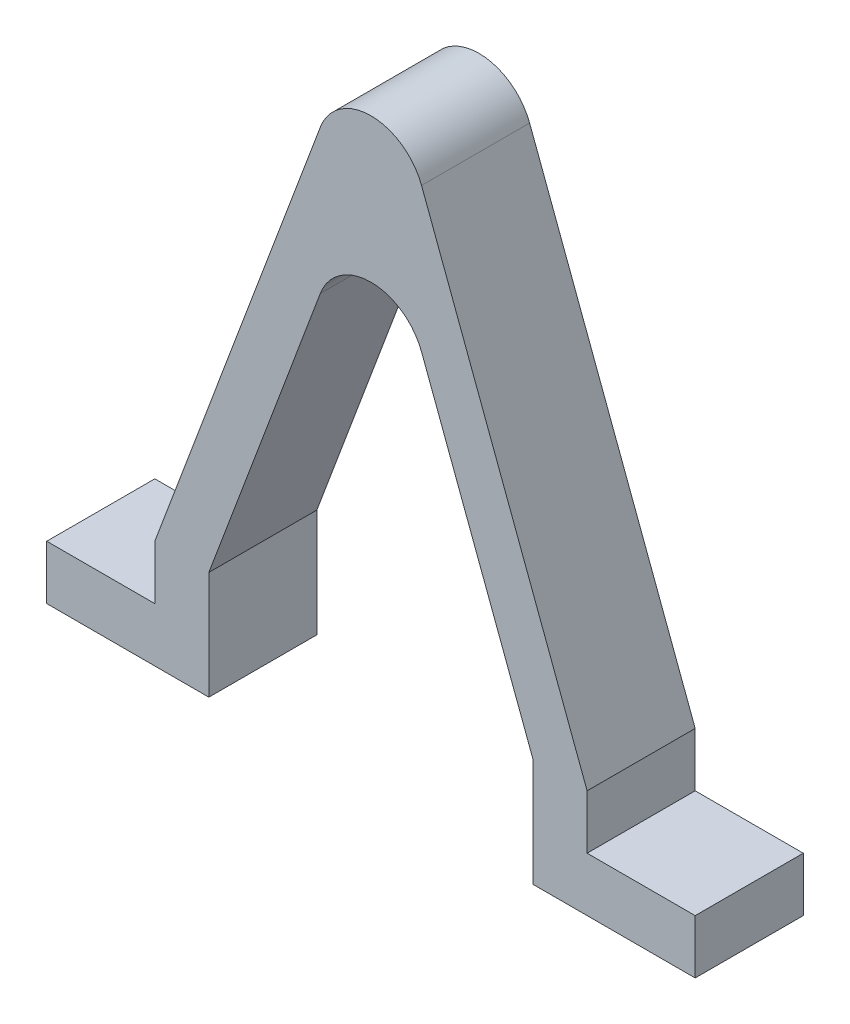
ISO-10303-21;
HEADER;
FILE_DESCRIPTION(('STEP AP214'),'2;1');
FILE_NAME('part.step','',(''),(''),'','','');
FILE_SCHEMA(('AUTOMOTIVE_DESIGN { 1 0 10303 214 1 1 1 1 }'));
ENDSEC;
DATA;
#1=APPLICATION_CONTEXT('core data for automotive mechanical design processes');
#2=APPLICATION_PROTOCOL_DEFINITION('international standard','automotive_design',2000,#1);
#3=PRODUCT_CONTEXT('',#1,'mechanical');
#4=PRODUCT('Part','Part','',(#3));
#5=PRODUCT_RELATED_PRODUCT_CATEGORY('part','',(#4));
#6=PRODUCT_DEFINITION_FORMATION('','',#4);
#7=PRODUCT_DEFINITION_CONTEXT('part definition',#1,'design');
#8=PRODUCT_DEFINITION('design','',#6,#7);
#9=PRODUCT_DEFINITION_SHAPE('','',#8);
#10=(LENGTH_UNIT() NAMED_UNIT(*) SI_UNIT(.MILLI.,.METRE.));
#11=(NAMED_UNIT(*) PLANE_ANGLE_UNIT() SI_UNIT($,.RADIAN.));
#12=(NAMED_UNIT(*) SI_UNIT($,.STERADIAN.) SOLID_ANGLE_UNIT());
#13=UNCERTAINTY_MEASURE_WITH_UNIT(LENGTH_MEASURE(1.E-05),#10,'distance_accuracy_value','');
#14=(GEOMETRIC_REPRESENTATION_CONTEXT(3) GLOBAL_UNCERTAINTY_ASSIGNED_CONTEXT((#13)) GLOBAL_UNIT_ASSIGNED_CONTEXT((#10,
#11,#12)) REPRESENTATION_CONTEXT('',''));
#15=CARTESIAN_POINT('',(0.,0.,0.));
#16=DIRECTION('',(0.,0.,1.));
#17=DIRECTION('',(1.,0.,0.));
#18=AXIS2_PLACEMENT_3D('',#15,#16,#17);
#19=CARTESIAN_POINT('',(0.,5.,10.));
#20=DIRECTION('',(1.,0.,0.));
#21=DIRECTION('',(0.,0.,-1.));
#22=AXIS2_PLACEMENT_3D('',#19,#20,#21);
#23=PLANE('',#22);
#24=DIRECTION('',(0.,-1.,0.));
#25=VECTOR('',#24,1.);
#26=CARTESIAN_POINT('',(0.,5.,0.));
#27=LINE('',#26,#25);
#28=CARTESIAN_POINT('',(0.,5.,0.));
#29=VERTEX_POINT('',#28);
#30=CARTESIAN_POINT('',(0.,0.,0.));
#31=VERTEX_POINT('',#30);
#32=EDGE_CURVE('E178',#29,#31,#27,.T.);
#33=ORIENTED_EDGE('',*,*,#32,.T.);
#34=DIRECTION('',(0.,0.,-1.));
#35=VECTOR('',#34,1.);
#36=CARTESIAN_POINT('',(0.,0.,10.));
#37=LINE('',#36,#35);
#38=CARTESIAN_POINT('',(0.,0.,10.));
#39=VERTEX_POINT('',#38);
#40=EDGE_CURVE('E157',#39,#31,#37,.T.);
#41=ORIENTED_EDGE('',*,*,#40,.F.);
#42=DIRECTION('',(0.,-1.,0.));
#43=VECTOR('',#42,1.);
#44=CARTESIAN_POINT('',(0.,5.,10.));
#45=LINE('',#44,#43);
#46=CARTESIAN_POINT('',(0.,5.,10.));
#47=VERTEX_POINT('',#46);
#48=EDGE_CURVE('E165',#47,#39,#45,.T.);
#49=ORIENTED_EDGE('',*,*,#48,.F.);
#50=DIRECTION('',(0.,0.,-1.));
#51=VECTOR('',#50,1.);
#52=CARTESIAN_POINT('',(0.,5.,10.));
#53=LINE('',#52,#51);
#54=EDGE_CURVE('E231',#47,#29,#53,.T.);
#55=ORIENTED_EDGE('',*,*,#54,.T.);
#56=EDGE_LOOP('',(#33,#41,#49,#55));
#57=FACE_BOUND('',#56,.T.);
#58=ADVANCED_FACE('F39',(#57),#23,.F.);
#59=CARTESIAN_POINT('',(0.,0.,10.));
#60=DIRECTION('',(0.,1.,0.));
#61=DIRECTION('',(0.,0.,1.));
#62=AXIS2_PLACEMENT_3D('',#59,#60,#61);
#63=PLANE('',#62);
#64=DIRECTION('',(1.,0.,0.));
#65=VECTOR('',#64,1.);
#66=CARTESIAN_POINT('',(0.,0.,0.));
#67=LINE('',#66,#65);
#68=CARTESIAN_POINT('',(15.,0.,0.));
#69=VERTEX_POINT('',#68);
#70=EDGE_CURVE('E287',#31,#69,#67,.T.);
#71=ORIENTED_EDGE('',*,*,#70,.T.);
#72=DIRECTION('',(0.,0.,-1.));
#73=VECTOR('',#72,1.);
#74=CARTESIAN_POINT('',(15.,0.,10.));
#75=LINE('',#74,#73);
#76=CARTESIAN_POINT('',(15.,0.,10.));
#77=VERTEX_POINT('',#76);
#78=EDGE_CURVE('E160',#77,#69,#75,.T.);
#79=ORIENTED_EDGE('',*,*,#78,.F.);
#80=DIRECTION('',(1.,0.,0.));
#81=VECTOR('',#80,1.);
#82=CARTESIAN_POINT('',(0.,0.,10.));
#83=LINE('',#82,#81);
#84=EDGE_CURVE('E153',#39,#77,#83,.T.);
#85=ORIENTED_EDGE('',*,*,#84,.F.);
#86=ORIENTED_EDGE('',*,*,#40,.T.);
#87=EDGE_LOOP('',(#71,#79,#85,#86));
#88=FACE_BOUND('',#87,.T.);
#89=ADVANCED_FACE('F155',(#88),#63,.F.);
#90=CARTESIAN_POINT('',(15.,0.,10.));
#91=DIRECTION('',(-1.,0.,0.));
#92=DIRECTION('',(0.,0.,1.));
#93=AXIS2_PLACEMENT_3D('',#90,#91,#92);
#94=PLANE('',#93);
#95=DIRECTION('',(0.,1.,0.));
#96=VECTOR('',#95,1.);
#97=CARTESIAN_POINT('',(15.,0.,0.));
#98=LINE('',#97,#96);
#99=CARTESIAN_POINT('',(15.,10.,0.));
#100=VERTEX_POINT('',#99);
#101=EDGE_CURVE('E278',#69,#100,#98,.T.);
#102=ORIENTED_EDGE('',*,*,#101,.T.);
#103=DIRECTION('',(0.,0.,-1.));
#104=VECTOR('',#103,1.);
#105=CARTESIAN_POINT('',(15.,10.,10.));
#106=LINE('',#105,#104);
#107=CARTESIAN_POINT('',(15.,10.,10.));
#108=VERTEX_POINT('',#107);
#109=EDGE_CURVE('E187',#108,#100,#106,.T.);
#110=ORIENTED_EDGE('',*,*,#109,.F.);
#111=DIRECTION('',(0.,1.,0.));
#112=VECTOR('',#111,1.);
#113=CARTESIAN_POINT('',(15.,0.,10.));
#114=LINE('',#113,#112);
#115=EDGE_CURVE('E164',#77,#108,#114,.T.);
#116=ORIENTED_EDGE('',*,*,#115,.F.);
#117=ORIENTED_EDGE('',*,*,#78,.T.);
#118=EDGE_LOOP('',(#102,#110,#116,#117));
#119=FACE_BOUND('',#118,.T.);
#120=ADVANCED_FACE('F328',(#119),#94,.F.);
#121=CARTESIAN_POINT('',(15.,10.,10.));
#122=DIRECTION('',(-0.936329177569045,0.351123441588392,0.));
#123=DIRECTION('',(-0.351123441588392,-0.936329177569045,0.));
#124=AXIS2_PLACEMENT_3D('',#121,#122,#123);
#125=PLANE('',#124);
#126=DIRECTION('',(0.351123441588392,0.936329177569045,0.));
#127=VECTOR('',#126,1.);
#128=CARTESIAN_POINT('',(15.,10.,0.));
#129=LINE('',#128,#127);
#130=CARTESIAN_POINT('',(25.3183541121548,37.5156109657461,0.));
#131=VERTEX_POINT('',#130);
#132=EDGE_CURVE('E272',#100,#131,#129,.T.);
#133=ORIENTED_EDGE('',*,*,#132,.T.);
#134=DIRECTION('',(0.,0.,-1.));
#135=VECTOR('',#134,1.);
#136=CARTESIAN_POINT('',(25.3183541121548,37.5156109657461,10.));
#137=LINE('',#136,#135);
#138=CARTESIAN_POINT('',(25.3183541121548,37.5156109657461,10.));
#139=VERTEX_POINT('',#138);
#140=EDGE_CURVE('E185',#131,#139,#137,.F.);
#141=ORIENTED_EDGE('',*,*,#140,.T.);
#142=DIRECTION('',(0.351123441588392,0.936329177569045,0.));
#143=VECTOR('',#142,1.);
#144=CARTESIAN_POINT('',(15.,10.,10.));
#145=LINE('',#144,#143);
#146=EDGE_CURVE('E275',#108,#139,#145,.T.);
#147=ORIENTED_EDGE('',*,*,#146,.F.);
#148=ORIENTED_EDGE('',*,*,#109,.T.);
#149=EDGE_LOOP('',(#133,#141,#147,#148));
#150=FACE_BOUND('',#149,.T.);
#151=ADVANCED_FACE('F271',(#150),#125,.F.);
#152=CARTESIAN_POINT('',(30.,50.,10.));
#153=DIRECTION('',(0.936329177569045,0.351123441588392,0.));
#154=DIRECTION('',(-0.351123441588392,0.936329177569045,0.));
#155=AXIS2_PLACEMENT_3D('',#152,#153,#154);
#156=PLANE('',#155);
#157=DIRECTION('',(0.351123441588392,-0.936329177569045,0.));
#158=VECTOR('',#157,1.);
#159=CARTESIAN_POINT('',(30.,50.,10.));
#160=LINE('',#159,#158);
#161=CARTESIAN_POINT('',(34.6816458878452,37.5156109657461,10.));
#162=VERTEX_POINT('',#161);
#163=CARTESIAN_POINT('',(45.,10.,10.));
#164=VERTEX_POINT('',#163);
#165=EDGE_CURVE('E332',#162,#164,#160,.T.);
#166=ORIENTED_EDGE('',*,*,#165,.F.);
#167=DIRECTION('',(0.,0.,-1.));
#168=VECTOR('',#167,1.);
#169=CARTESIAN_POINT('',(34.6816458878452,37.5156109657461,0.));
#170=LINE('',#169,#168);
#171=CARTESIAN_POINT('',(34.6816458878452,37.5156109657461,0.));
#172=VERTEX_POINT('',#171);
#173=EDGE_CURVE('E180',#162,#172,#170,.T.);
#174=ORIENTED_EDGE('',*,*,#173,.T.);
#175=DIRECTION('',(0.351123441588392,-0.936329177569045,0.));
#176=VECTOR('',#175,1.);
#177=CARTESIAN_POINT('',(30.,50.,0.));
#178=LINE('',#177,#176);
#179=CARTESIAN_POINT('',(45.,10.,0.));
#180=VERTEX_POINT('',#179);
#181=EDGE_CURVE('E281',#172,#180,#178,.T.);
#182=ORIENTED_EDGE('',*,*,#181,.T.);
#183=DIRECTION('',(0.,0.,-1.));
#184=VECTOR('',#183,1.);
#185=CARTESIAN_POINT('',(45.,10.,10.));
#186=LINE('',#185,#184);
#187=EDGE_CURVE('E261',#164,#180,#186,.T.);
#188=ORIENTED_EDGE('',*,*,#187,.F.);
#189=EDGE_LOOP('',(#166,#174,#182,#188));
#190=FACE_BOUND('',#189,.T.);
#191=ADVANCED_FACE('F367',(#190),#156,.F.);
#192=CARTESIAN_POINT('',(45.,10.,10.));
#193=DIRECTION('',(1.,0.,0.));
#194=DIRECTION('',(0.,0.,-1.));
#195=AXIS2_PLACEMENT_3D('',#192,#193,#194);
#196=PLANE('',#195);
#197=DIRECTION('',(0.,-1.,0.));
#198=VECTOR('',#197,1.);
#199=CARTESIAN_POINT('',(45.,10.,0.));
#200=LINE('',#199,#198);
#201=CARTESIAN_POINT('',(45.,0.,0.));
#202=VERTEX_POINT('',#201);
#203=EDGE_CURVE('E285',#180,#202,#200,.T.);
#204=ORIENTED_EDGE('',*,*,#203,.T.);
#205=DIRECTION('',(0.,0.,-1.));
#206=VECTOR('',#205,1.);
#207=CARTESIAN_POINT('',(45.,0.,10.));
#208=LINE('',#207,#206);
#209=CARTESIAN_POINT('',(45.,0.,10.));
#210=VERTEX_POINT('',#209);
#211=EDGE_CURVE('E257',#210,#202,#208,.T.);
#212=ORIENTED_EDGE('',*,*,#211,.F.);
#213=DIRECTION('',(0.,-1.,0.));
#214=VECTOR('',#213,1.);
#215=CARTESIAN_POINT('',(45.,10.,10.));
#216=LINE('',#215,#214);
#217=EDGE_CURVE('E337',#164,#210,#216,.T.);
#218=ORIENTED_EDGE('',*,*,#217,.F.);
#219=ORIENTED_EDGE('',*,*,#187,.T.);
#220=EDGE_LOOP('',(#204,#212,#218,#219));
#221=FACE_BOUND('',#220,.T.);
#222=ADVANCED_FACE('F363',(#221),#196,.F.);
#223=CARTESIAN_POINT('',(45.,0.,10.));
#224=DIRECTION('',(0.,1.,0.));
#225=DIRECTION('',(0.,0.,1.));
#226=AXIS2_PLACEMENT_3D('',#223,#224,#225);
#227=PLANE('',#226);
#228=DIRECTION('',(1.,0.,0.));
#229=VECTOR('',#228,1.);
#230=CARTESIAN_POINT('',(45.,0.,0.));
#231=LINE('',#230,#229);
#232=CARTESIAN_POINT('',(60.,0.,0.));
#233=VERTEX_POINT('',#232);
#234=EDGE_CURVE('E293',#202,#233,#231,.T.);
#235=ORIENTED_EDGE('',*,*,#234,.T.);
#236=DIRECTION('',(0.,0.,-1.));
#237=VECTOR('',#236,1.);
#238=CARTESIAN_POINT('',(60.,0.,10.));
#239=LINE('',#238,#237);
#240=CARTESIAN_POINT('',(60.,0.,10.));
#241=VERTEX_POINT('',#240);
#242=EDGE_CURVE('E253',#241,#233,#239,.T.);
#243=ORIENTED_EDGE('',*,*,#242,.F.);
#244=DIRECTION('',(1.,0.,0.));
#245=VECTOR('',#244,1.);
#246=CARTESIAN_POINT('',(45.,0.,10.));
#247=LINE('',#246,#245);
#248=EDGE_CURVE('E340',#210,#241,#247,.T.);
#249=ORIENTED_EDGE('',*,*,#248,.F.);
#250=ORIENTED_EDGE('',*,*,#211,.T.);
#251=EDGE_LOOP('',(#235,#243,#249,#250));
#252=FACE_BOUND('',#251,.T.);
#253=ADVANCED_FACE('F359',(#252),#227,.F.);
#254=CARTESIAN_POINT('',(60.,0.,10.));
#255=DIRECTION('',(-1.,0.,0.));
#256=DIRECTION('',(0.,0.,1.));
#257=AXIS2_PLACEMENT_3D('',#254,#255,#256);
#258=PLANE('',#257);
#259=DIRECTION('',(0.,1.,0.));
#260=VECTOR('',#259,1.);
#261=CARTESIAN_POINT('',(60.,0.,0.));
#262=LINE('',#261,#260);
#263=CARTESIAN_POINT('',(60.,5.00000000000001,0.));
#264=VERTEX_POINT('',#263);
#265=EDGE_CURVE('E296',#233,#264,#262,.T.);
#266=ORIENTED_EDGE('',*,*,#265,.T.);
#267=DIRECTION('',(0.,0.,-1.));
#268=VECTOR('',#267,1.);
#269=CARTESIAN_POINT('',(60.,5.00000000000001,10.));
#270=LINE('',#269,#268);
#271=CARTESIAN_POINT('',(60.,5.00000000000001,10.));
#272=VERTEX_POINT('',#271);
#273=EDGE_CURVE('E249',#272,#264,#270,.T.);
#274=ORIENTED_EDGE('',*,*,#273,.F.);
#275=DIRECTION('',(0.,1.,0.));
#276=VECTOR('',#275,1.);
#277=CARTESIAN_POINT('',(60.,0.,10.));
#278=LINE('',#277,#276);
#279=EDGE_CURVE('E343',#241,#272,#278,.T.);
#280=ORIENTED_EDGE('',*,*,#279,.F.);
#281=ORIENTED_EDGE('',*,*,#242,.T.);
#282=EDGE_LOOP('',(#266,#274,#280,#281));
#283=FACE_BOUND('',#282,.T.);
#284=ADVANCED_FACE('F355',(#283),#258,.F.);
#285=CARTESIAN_POINT('',(60.,5.00000000000001,10.));
#286=DIRECTION('',(0.,-1.,0.));
#287=DIRECTION('',(0.,0.,-1.));
#288=AXIS2_PLACEMENT_3D('',#285,#286,#287);
#289=PLANE('',#288);
#290=DIRECTION('',(-1.,0.,0.));
#291=VECTOR('',#290,1.);
#292=CARTESIAN_POINT('',(60.,5.00000000000001,0.));
#293=LINE('',#292,#291);
#294=CARTESIAN_POINT('',(50.,5.00000000000001,0.));
#295=VERTEX_POINT('',#294);
#296=EDGE_CURVE('E299',#264,#295,#293,.T.);
#297=ORIENTED_EDGE('',*,*,#296,.T.);
#298=DIRECTION('',(0.,0.,-1.));
#299=VECTOR('',#298,1.);
#300=CARTESIAN_POINT('',(50.,5.00000000000001,10.));
#301=LINE('',#300,#299);
#302=CARTESIAN_POINT('',(50.,5.00000000000001,10.));
#303=VERTEX_POINT('',#302);
#304=EDGE_CURVE('E245',#303,#295,#301,.T.);
#305=ORIENTED_EDGE('',*,*,#304,.F.);
#306=DIRECTION('',(-1.,0.,0.));
#307=VECTOR('',#306,1.);
#308=CARTESIAN_POINT('',(60.,5.00000000000001,10.));
#309=LINE('',#308,#307);
#310=EDGE_CURVE('E318',#272,#303,#309,.T.);
#311=ORIENTED_EDGE('',*,*,#310,.F.);
#312=ORIENTED_EDGE('',*,*,#273,.T.);
#313=EDGE_LOOP('',(#297,#305,#311,#312));
#314=FACE_BOUND('',#313,.T.);
#315=ADVANCED_FACE('F350',(#314),#289,.F.);
#316=CARTESIAN_POINT('',(50.,5.00000000000001,10.));
#317=DIRECTION('',(-1.,0.,0.));
#318=DIRECTION('',(0.,0.,1.));
#319=AXIS2_PLACEMENT_3D('',#316,#317,#318);
#320=PLANE('',#319);
#321=DIRECTION('',(0.,1.,0.));
#322=VECTOR('',#321,1.);
#323=CARTESIAN_POINT('',(50.,5.00000000000001,0.));
#324=LINE('',#323,#322);
#325=CARTESIAN_POINT('',(50.,10.,0.));
#326=VERTEX_POINT('',#325);
#327=EDGE_CURVE('E225',#295,#326,#324,.T.);
#328=ORIENTED_EDGE('',*,*,#327,.T.);
#329=DIRECTION('',(0.,0.,-1.));
#330=VECTOR('',#329,1.);
#331=CARTESIAN_POINT('',(50.,10.,10.));
#332=LINE('',#331,#330);
#333=CARTESIAN_POINT('',(50.,10.,10.));
#334=VERTEX_POINT('',#333);
#335=EDGE_CURVE('E241',#334,#326,#332,.T.);
#336=ORIENTED_EDGE('',*,*,#335,.F.);
#337=DIRECTION('',(0.,1.,0.));
#338=VECTOR('',#337,1.);
#339=CARTESIAN_POINT('',(50.,5.00000000000001,10.));
#340=LINE('',#339,#338);
#341=EDGE_CURVE('E312',#303,#334,#340,.T.);
#342=ORIENTED_EDGE('',*,*,#341,.F.);
#343=ORIENTED_EDGE('',*,*,#304,.T.);
#344=EDGE_LOOP('',(#328,#336,#342,#343));
#345=FACE_BOUND('',#344,.T.);
#346=ADVANCED_FACE('F305',(#345),#320,.F.);
#347=CARTESIAN_POINT('',(50.,10.,10.));
#348=DIRECTION('',(-0.936329177569045,-0.351123441588392,0.));
#349=DIRECTION('',(0.351123441588392,-0.936329177569045,0.));
#350=AXIS2_PLACEMENT_3D('',#347,#348,#349);
#351=PLANE('',#350);
#352=DIRECTION('',(-0.351123441588392,0.936329177569044,0.));
#353=VECTOR('',#352,1.);
#354=CARTESIAN_POINT('',(50.,10.,0.));
#355=LINE('',#354,#353);
#356=CARTESIAN_POINT('',(34.6816458878452,50.8489442990794,0.));
#357=VERTEX_POINT('',#356);
#358=EDGE_CURVE('E220',#326,#357,#355,.T.);
#359=ORIENTED_EDGE('',*,*,#358,.T.);
#360=DIRECTION('',(0.,0.,-1.));
#361=VECTOR('',#360,1.);
#362=CARTESIAN_POINT('',(34.6816458878452,50.8489442990794,10.));
#363=LINE('',#362,#361);
#364=CARTESIAN_POINT('',(34.6816458878452,50.8489442990794,10.));
#365=VERTEX_POINT('',#364);
#366=EDGE_CURVE('E48',#357,#365,#363,.F.);
#367=ORIENTED_EDGE('',*,*,#366,.T.);
#368=DIRECTION('',(-0.351123441588392,0.936329177569044,0.));
#369=VECTOR('',#368,1.);
#370=CARTESIAN_POINT('',(50.,10.,10.));
#371=LINE('',#370,#369);
#372=EDGE_CURVE('E310',#334,#365,#371,.T.);
#373=ORIENTED_EDGE('',*,*,#372,.F.);
#374=ORIENTED_EDGE('',*,*,#335,.T.);
#375=EDGE_LOOP('',(#359,#367,#373,#374));
#376=FACE_BOUND('',#375,.T.);
#377=ADVANCED_FACE('F309',(#376),#351,.F.);
#378=CARTESIAN_POINT('',(30.,63.3333333333333,10.));
#379=DIRECTION('',(0.936329177569045,-0.351123441588392,0.));
#380=DIRECTION('',(0.351123441588392,0.936329177569045,0.));
#381=AXIS2_PLACEMENT_3D('',#378,#379,#380);
#382=PLANE('',#381);
#383=DIRECTION('',(-0.351123441588392,-0.936329177569044,0.));
#384=VECTOR('',#383,1.);
#385=CARTESIAN_POINT('',(30.,63.3333333333333,10.));
#386=LINE('',#385,#384);
#387=CARTESIAN_POINT('',(25.3183541121548,50.8489442990794,10.));
#388=VERTEX_POINT('',#387);
#389=CARTESIAN_POINT('',(10.,10.,10.));
#390=VERTEX_POINT('',#389);
#391=EDGE_CURVE('E212',#388,#390,#386,.T.);
#392=ORIENTED_EDGE('',*,*,#391,.F.);
#393=DIRECTION('',(0.,0.,-1.));
#394=VECTOR('',#393,1.);
#395=CARTESIAN_POINT('',(25.3183541121548,50.8489442990794,10.));
#396=LINE('',#395,#394);
#397=CARTESIAN_POINT('',(25.3183541121548,50.8489442990794,0.));
#398=VERTEX_POINT('',#397);
#399=EDGE_CURVE('E199',#388,#398,#396,.T.);
#400=ORIENTED_EDGE('',*,*,#399,.T.);
#401=DIRECTION('',(-0.351123441588392,-0.936329177569044,0.));
#402=VECTOR('',#401,1.);
#403=CARTESIAN_POINT('',(30.,63.3333333333333,0.));
#404=LINE('',#403,#402);
#405=CARTESIAN_POINT('',(10.,10.,0.));
#406=VERTEX_POINT('',#405);
#407=EDGE_CURVE('E210',#398,#406,#404,.T.);
#408=ORIENTED_EDGE('',*,*,#407,.T.);
#409=DIRECTION('',(0.,0.,-1.));
#410=VECTOR('',#409,1.);
#411=CARTESIAN_POINT('',(10.,10.,10.));
#412=LINE('',#411,#410);
#413=EDGE_CURVE('E238',#390,#406,#412,.T.);
#414=ORIENTED_EDGE('',*,*,#413,.F.);
#415=EDGE_LOOP('',(#392,#400,#408,#414));
#416=FACE_BOUND('',#415,.T.);
#417=ADVANCED_FACE('F208',(#416),#382,.F.);
#418=CARTESIAN_POINT('',(10.,10.,10.));
#419=DIRECTION('',(1.,0.,0.));
#420=DIRECTION('',(0.,0.,-1.));
#421=AXIS2_PLACEMENT_3D('',#418,#419,#420);
#422=PLANE('',#421);
#423=DIRECTION('',(0.,-1.,0.));
#424=VECTOR('',#423,1.);
#425=CARTESIAN_POINT('',(10.,10.,0.));
#426=LINE('',#425,#424);
#427=CARTESIAN_POINT('',(10.,5.,0.));
#428=VERTEX_POINT('',#427);
#429=EDGE_CURVE('E218',#406,#428,#426,.T.);
#430=ORIENTED_EDGE('',*,*,#429,.T.);
#431=DIRECTION('',(0.,0.,-1.));
#432=VECTOR('',#431,1.);
#433=CARTESIAN_POINT('',(10.,5.,10.));
#434=LINE('',#433,#432);
#435=CARTESIAN_POINT('',(10.,5.,10.));
#436=VERTEX_POINT('',#435);
#437=EDGE_CURVE('E234',#436,#428,#434,.T.);
#438=ORIENTED_EDGE('',*,*,#437,.F.);
#439=DIRECTION('',(0.,-1.,0.));
#440=VECTOR('',#439,1.);
#441=CARTESIAN_POINT('',(10.,10.,10.));
#442=LINE('',#441,#440);
#443=EDGE_CURVE('E316',#390,#436,#442,.T.);
#444=ORIENTED_EDGE('',*,*,#443,.F.);
#445=ORIENTED_EDGE('',*,*,#413,.T.);
#446=EDGE_LOOP('',(#430,#438,#444,#445));
#447=FACE_BOUND('',#446,.T.);
#448=ADVANCED_FACE('F405',(#447),#422,.F.);
#449=CARTESIAN_POINT('',(10.,5.,10.));
#450=DIRECTION('',(0.,-1.,0.));
#451=DIRECTION('',(1.,0.,0.));
#452=AXIS2_PLACEMENT_3D('',#449,#450,#451);
#453=PLANE('',#452);
#454=DIRECTION('',(-1.,0.,0.));
#455=VECTOR('',#454,1.);
#456=CARTESIAN_POINT('',(10.,5.,0.));
#457=LINE('',#456,#455);
#458=EDGE_CURVE('E175',#428,#29,#457,.T.);
#459=ORIENTED_EDGE('',*,*,#458,.T.);
#460=ORIENTED_EDGE('',*,*,#54,.F.);
#461=DIRECTION('',(-1.,0.,0.));
#462=VECTOR('',#461,1.);
#463=CARTESIAN_POINT('',(10.,5.,10.));
#464=LINE('',#463,#462);
#465=EDGE_CURVE('E170',#436,#47,#464,.T.);
#466=ORIENTED_EDGE('',*,*,#465,.F.);
#467=ORIENTED_EDGE('',*,*,#437,.T.);
#468=EDGE_LOOP('',(#459,#460,#466,#467));
#469=FACE_BOUND('',#468,.T.);
#470=ADVANCED_FACE('F408',(#469),#453,.F.);
#471=CARTESIAN_POINT('',(0.,0.,10.));
#472=DIRECTION('',(0.,0.,1.));
#473=DIRECTION('',(1.,0.,0.));
#474=AXIS2_PLACEMENT_3D('',#471,#472,#473);
#475=PLANE('',#474);
#476=ORIENTED_EDGE('',*,*,#372,.T.);
#477=CARTESIAN_POINT('',(30.,49.0933270911375,10.));
#478=DIRECTION('',(0.,0.,1.));
#479=DIRECTION('',(1.,0.,0.));
#480=AXIS2_PLACEMENT_3D('',#477,#478,#479);
#481=CIRCLE('',#480,5.);
#482=EDGE_CURVE('E11',#365,#388,#481,.T.);
#483=ORIENTED_EDGE('',*,*,#482,.T.);
#484=ORIENTED_EDGE('',*,*,#391,.T.);
#485=ORIENTED_EDGE('',*,*,#443,.T.);
#486=ORIENTED_EDGE('',*,*,#465,.T.);
#487=ORIENTED_EDGE('',*,*,#48,.T.);
#488=ORIENTED_EDGE('',*,*,#84,.T.);
#489=ORIENTED_EDGE('',*,*,#115,.T.);
#490=ORIENTED_EDGE('',*,*,#146,.T.);
#491=CARTESIAN_POINT('',(30.,35.7599937578041,10.));
#492=DIRECTION('',(0.,0.,1.));
#493=DIRECTION('',(1.,0.,0.));
#494=AXIS2_PLACEMENT_3D('',#491,#492,#493);
#495=CIRCLE('',#494,5.);
#496=EDGE_CURVE('E196',#139,#162,#495,.F.);
#497=ORIENTED_EDGE('',*,*,#496,.T.);
#498=ORIENTED_EDGE('',*,*,#165,.T.);
#499=ORIENTED_EDGE('',*,*,#217,.T.);
#500=ORIENTED_EDGE('',*,*,#248,.T.);
#501=ORIENTED_EDGE('',*,*,#279,.T.);
#502=ORIENTED_EDGE('',*,*,#310,.T.);
#503=ORIENTED_EDGE('',*,*,#341,.T.);
#504=EDGE_LOOP('',(#476,#483,#484,#485,#486,#487,#488,#489,#490,#497,#498,#499,#500,#501,#502,#503));
#505=FACE_BOUND('',#504,.T.);
#506=ADVANCED_FACE('F168',(#505),#475,.T.);
#507=CARTESIAN_POINT('',(0.,0.,0.));
#508=DIRECTION('',(0.,0.,1.));
#509=DIRECTION('',(1.,0.,0.));
#510=AXIS2_PLACEMENT_3D('',#507,#508,#509);
#511=PLANE('',#510);
#512=ORIENTED_EDGE('',*,*,#407,.F.);
#513=CARTESIAN_POINT('',(30.,49.0933270911375,0.));
#514=DIRECTION('',(0.,0.,1.));
#515=DIRECTION('',(1.,0.,0.));
#516=AXIS2_PLACEMENT_3D('',#513,#514,#515);
#517=CIRCLE('',#516,5.);
#518=EDGE_CURVE('E62',#398,#357,#517,.F.);
#519=ORIENTED_EDGE('',*,*,#518,.T.);
#520=ORIENTED_EDGE('',*,*,#358,.F.);
#521=ORIENTED_EDGE('',*,*,#327,.F.);
#522=ORIENTED_EDGE('',*,*,#296,.F.);
#523=ORIENTED_EDGE('',*,*,#265,.F.);
#524=ORIENTED_EDGE('',*,*,#234,.F.);
#525=ORIENTED_EDGE('',*,*,#203,.F.);
#526=ORIENTED_EDGE('',*,*,#181,.F.);
#527=CARTESIAN_POINT('',(30.,35.7599937578041,0.));
#528=DIRECTION('',(0.,0.,1.));
#529=DIRECTION('',(1.,0.,0.));
#530=AXIS2_PLACEMENT_3D('',#527,#528,#529);
#531=CIRCLE('',#530,5.);
#532=EDGE_CURVE('E193',#172,#131,#531,.T.);
#533=ORIENTED_EDGE('',*,*,#532,.T.);
#534=ORIENTED_EDGE('',*,*,#132,.F.);
#535=ORIENTED_EDGE('',*,*,#101,.F.);
#536=ORIENTED_EDGE('',*,*,#70,.F.);
#537=ORIENTED_EDGE('',*,*,#32,.F.);
#538=ORIENTED_EDGE('',*,*,#458,.F.);
#539=ORIENTED_EDGE('',*,*,#429,.F.);
#540=EDGE_LOOP('',(#512,#519,#520,#521,#522,#523,#524,#525,#526,#533,#534,#535,#536,#537,#538,#539));
#541=FACE_BOUND('',#540,.T.);
#542=ADVANCED_FACE('F216',(#541),#511,.F.);
#543=CARTESIAN_POINT('',(30.,35.7599937578041,10.));
#544=DIRECTION('',(0.,0.,1.));
#545=DIRECTION('',(1.,0.,0.));
#546=AXIS2_PLACEMENT_3D('',#543,#544,#545);
#547=CYLINDRICAL_SURFACE('',#546,5.);
#548=ORIENTED_EDGE('',*,*,#496,.F.);
#549=ORIENTED_EDGE('',*,*,#140,.F.);
#550=ORIENTED_EDGE('',*,*,#532,.F.);
#551=ORIENTED_EDGE('',*,*,#173,.F.);
#552=EDGE_LOOP('',(#548,#549,#550,#551));
#553=FACE_BOUND('',#552,.T.);
#554=ADVANCED_FACE('F371',(#553),#547,.F.);
#555=CARTESIAN_POINT('',(30.,49.0933270911375,10.));
#556=DIRECTION('',(0.,0.,-1.));
#557=DIRECTION('',(-1.,0.,0.));
#558=AXIS2_PLACEMENT_3D('',#555,#556,#557);
#559=CYLINDRICAL_SURFACE('',#558,5.);
#560=ORIENTED_EDGE('',*,*,#482,.F.);
#561=ORIENTED_EDGE('',*,*,#366,.F.);
#562=ORIENTED_EDGE('',*,*,#518,.F.);
#563=ORIENTED_EDGE('',*,*,#399,.F.);
#564=EDGE_LOOP('',(#560,#561,#562,#563));
#565=FACE_BOUND('',#564,.T.);
#566=ADVANCED_FACE('F41',(#565),#559,.T.);
#567=CLOSED_SHELL('',(#58,#89,#120,#151,#191,#222,#253,#284,#315,#346,#377,#417,#448,#470,#506,
#542,#554,#566));
#568=MANIFOLD_SOLID_BREP('B2',#567);
#569=ADVANCED_BREP_SHAPE_REPRESENTATION('',(#18,#568),#14);
#570=SHAPE_DEFINITION_REPRESENTATION(#9,#569);
ENDSEC;
END-ISO-10303-21;
